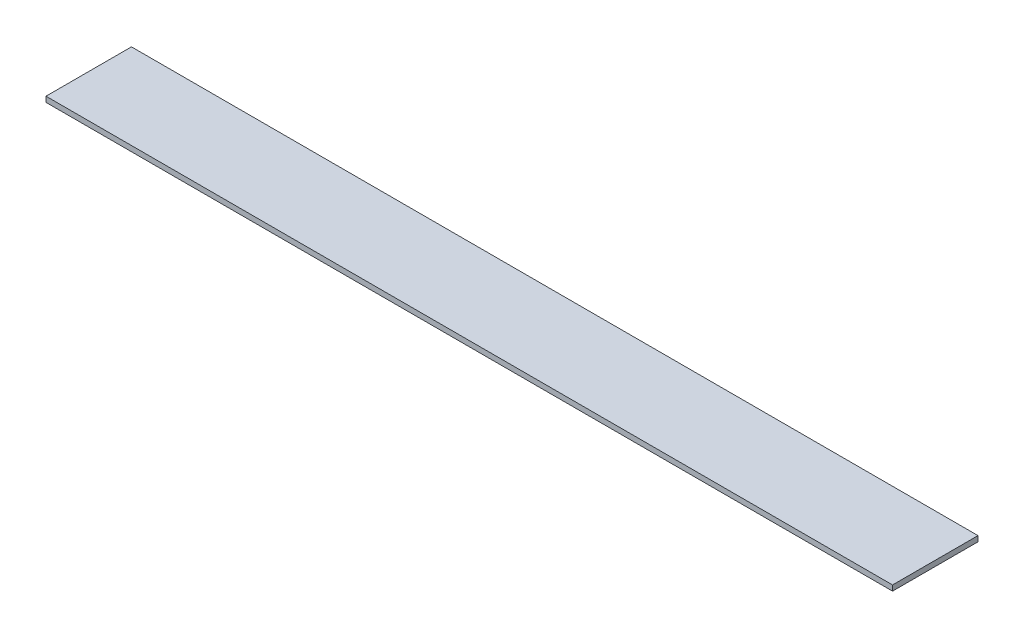
ISO-10303-21;
HEADER;
FILE_DESCRIPTION(('STEP AP214'),'2;1');
FILE_NAME('part.step','',(''),(''),'','','');
FILE_SCHEMA(('AUTOMOTIVE_DESIGN { 1 0 10303 214 1 1 1 1 }'));
ENDSEC;
DATA;
#1=APPLICATION_CONTEXT('core data for automotive mechanical design processes');
#2=APPLICATION_PROTOCOL_DEFINITION('international standard','automotive_design',2000,#1);
#3=PRODUCT_CONTEXT('',#1,'mechanical');
#4=PRODUCT('Part','Part','',(#3));
#5=PRODUCT_RELATED_PRODUCT_CATEGORY('part','',(#4));
#6=PRODUCT_DEFINITION_FORMATION('','',#4);
#7=PRODUCT_DEFINITION_CONTEXT('part definition',#1,'design');
#8=PRODUCT_DEFINITION('design','',#6,#7);
#9=PRODUCT_DEFINITION_SHAPE('','',#8);
#10=(LENGTH_UNIT() NAMED_UNIT(*) SI_UNIT(.MILLI.,.METRE.));
#11=(NAMED_UNIT(*) PLANE_ANGLE_UNIT() SI_UNIT($,.RADIAN.));
#12=(NAMED_UNIT(*) SI_UNIT($,.STERADIAN.) SOLID_ANGLE_UNIT());
#13=UNCERTAINTY_MEASURE_WITH_UNIT(LENGTH_MEASURE(1.E-05),#10,'distance_accuracy_value','');
#14=(GEOMETRIC_REPRESENTATION_CONTEXT(3) GLOBAL_UNCERTAINTY_ASSIGNED_CONTEXT((#13)) GLOBAL_UNIT_ASSIGNED_CONTEXT((#10,
#11,#12)) REPRESENTATION_CONTEXT('',''));
#15=CARTESIAN_POINT('',(0.,0.,0.));
#16=DIRECTION('',(0.,0.,1.));
#17=DIRECTION('',(1.,0.,0.));
#18=AXIS2_PLACEMENT_3D('',#15,#16,#17);
#19=CARTESIAN_POINT('',(940.,-12.,94.9));
#20=DIRECTION('',(1.,0.,0.));
#21=DIRECTION('',(0.,0.,-1.));
#22=AXIS2_PLACEMENT_3D('',#19,#20,#21);
#23=PLANE('',#22);
#24=DIRECTION('',(0.,0.,-1.));
#25=VECTOR('',#24,1.);
#26=CARTESIAN_POINT('',(940.,0.,94.9));
#27=LINE('',#26,#25);
#28=CARTESIAN_POINT('',(940.,0.,94.9));
#29=VERTEX_POINT('',#28);
#30=CARTESIAN_POINT('',(940.,0.,-94.9));
#31=VERTEX_POINT('',#30);
#32=EDGE_CURVE('E101',#29,#31,#27,.T.);
#33=ORIENTED_EDGE('',*,*,#32,.F.);
#34=DIRECTION('',(0.,1.,0.));
#35=VECTOR('',#34,1.);
#36=CARTESIAN_POINT('',(940.,-12.,94.9));
#37=LINE('',#36,#35);
#38=CARTESIAN_POINT('',(940.,-12.,94.9));
#39=VERTEX_POINT('',#38);
#40=EDGE_CURVE('E11',#39,#29,#37,.T.);
#41=ORIENTED_EDGE('',*,*,#40,.F.);
#42=DIRECTION('',(0.,0.,-1.));
#43=VECTOR('',#42,1.);
#44=CARTESIAN_POINT('',(940.,-12.,94.9));
#45=LINE('',#44,#43);
#46=CARTESIAN_POINT('',(940.,-12.,-94.9));
#47=VERTEX_POINT('',#46);
#48=EDGE_CURVE('E95',#39,#47,#45,.T.);
#49=ORIENTED_EDGE('',*,*,#48,.T.);
#50=DIRECTION('',(0.,1.,0.));
#51=VECTOR('',#50,1.);
#52=CARTESIAN_POINT('',(940.,-12.,-94.9));
#53=LINE('',#52,#51);
#54=EDGE_CURVE('E40',#47,#31,#53,.T.);
#55=ORIENTED_EDGE('',*,*,#54,.T.);
#56=EDGE_LOOP('',(#33,#41,#49,#55));
#57=FACE_BOUND('',#56,.T.);
#58=ADVANCED_FACE('F37',(#57),#23,.T.);
#59=CARTESIAN_POINT('',(-940.,-12.,94.9));
#60=DIRECTION('',(0.,0.,1.));
#61=DIRECTION('',(1.,0.,0.));
#62=AXIS2_PLACEMENT_3D('',#59,#60,#61);
#63=PLANE('',#62);
#64=DIRECTION('',(1.,0.,0.));
#65=VECTOR('',#64,1.);
#66=CARTESIAN_POINT('',(-940.,0.,94.9));
#67=LINE('',#66,#65);
#68=CARTESIAN_POINT('',(-940.,0.,94.9));
#69=VERTEX_POINT('',#68);
#70=EDGE_CURVE('E97',#69,#29,#67,.T.);
#71=ORIENTED_EDGE('',*,*,#70,.F.);
#72=DIRECTION('',(0.,1.,0.));
#73=VECTOR('',#72,1.);
#74=CARTESIAN_POINT('',(-940.,-12.,94.9));
#75=LINE('',#74,#73);
#76=CARTESIAN_POINT('',(-940.,-12.,94.9));
#77=VERTEX_POINT('',#76);
#78=EDGE_CURVE('E46',#77,#69,#75,.T.);
#79=ORIENTED_EDGE('',*,*,#78,.F.);
#80=DIRECTION('',(1.,0.,0.));
#81=VECTOR('',#80,1.);
#82=CARTESIAN_POINT('',(-940.,-12.,94.9));
#83=LINE('',#82,#81);
#84=EDGE_CURVE('E92',#77,#39,#83,.T.);
#85=ORIENTED_EDGE('',*,*,#84,.T.);
#86=ORIENTED_EDGE('',*,*,#40,.T.);
#87=EDGE_LOOP('',(#71,#79,#85,#86));
#88=FACE_BOUND('',#87,.T.);
#89=ADVANCED_FACE('F111',(#88),#63,.T.);
#90=CARTESIAN_POINT('',(-940.,-12.,94.9));
#91=DIRECTION('',(-1.,0.,0.));
#92=DIRECTION('',(0.,0.,1.));
#93=AXIS2_PLACEMENT_3D('',#90,#91,#92);
#94=PLANE('',#93);
#95=DIRECTION('',(0.,0.,1.));
#96=VECTOR('',#95,1.);
#97=CARTESIAN_POINT('',(-940.,0.,94.9));
#98=LINE('',#97,#96);
#99=CARTESIAN_POINT('',(-940.,0.,-94.9));
#100=VERTEX_POINT('',#99);
#101=EDGE_CURVE('E87',#100,#69,#98,.T.);
#102=ORIENTED_EDGE('',*,*,#101,.F.);
#103=DIRECTION('',(0.,1.,0.));
#104=VECTOR('',#103,1.);
#105=CARTESIAN_POINT('',(-940.,-12.,-94.9));
#106=LINE('',#105,#104);
#107=CARTESIAN_POINT('',(-940.,-12.,-94.9));
#108=VERTEX_POINT('',#107);
#109=EDGE_CURVE('E82',#108,#100,#106,.T.);
#110=ORIENTED_EDGE('',*,*,#109,.F.);
#111=DIRECTION('',(0.,0.,1.));
#112=VECTOR('',#111,1.);
#113=CARTESIAN_POINT('',(-940.,-12.,94.9));
#114=LINE('',#113,#112);
#115=EDGE_CURVE('E85',#108,#77,#114,.T.);
#116=ORIENTED_EDGE('',*,*,#115,.T.);
#117=ORIENTED_EDGE('',*,*,#78,.T.);
#118=EDGE_LOOP('',(#102,#110,#116,#117));
#119=FACE_BOUND('',#118,.T.);
#120=ADVANCED_FACE('F84',(#119),#94,.T.);
#121=CARTESIAN_POINT('',(-940.,-12.,-94.9));
#122=DIRECTION('',(0.,0.,-1.));
#123=DIRECTION('',(-1.,0.,0.));
#124=AXIS2_PLACEMENT_3D('',#121,#122,#123);
#125=PLANE('',#124);
#126=DIRECTION('',(-1.,0.,0.));
#127=VECTOR('',#126,1.);
#128=CARTESIAN_POINT('',(-940.,0.,-94.9));
#129=LINE('',#128,#127);
#130=EDGE_CURVE('E104',#31,#100,#129,.T.);
#131=ORIENTED_EDGE('',*,*,#130,.F.);
#132=ORIENTED_EDGE('',*,*,#54,.F.);
#133=DIRECTION('',(-1.,0.,0.));
#134=VECTOR('',#133,1.);
#135=CARTESIAN_POINT('',(-940.,-12.,-94.9));
#136=LINE('',#135,#134);
#137=EDGE_CURVE('E91',#47,#108,#136,.T.);
#138=ORIENTED_EDGE('',*,*,#137,.T.);
#139=ORIENTED_EDGE('',*,*,#109,.T.);
#140=EDGE_LOOP('',(#131,#132,#138,#139));
#141=FACE_BOUND('',#140,.T.);
#142=ADVANCED_FACE('F94',(#141),#125,.T.);
#143=CARTESIAN_POINT('',(0.,-12.,0.));
#144=DIRECTION('',(0.,-1.,0.));
#145=DIRECTION('',(0.,0.,-1.));
#146=AXIS2_PLACEMENT_3D('',#143,#144,#145);
#147=PLANE('',#146);
#148=ORIENTED_EDGE('',*,*,#48,.F.);
#149=ORIENTED_EDGE('',*,*,#84,.F.);
#150=ORIENTED_EDGE('',*,*,#115,.F.);
#151=ORIENTED_EDGE('',*,*,#137,.F.);
#152=EDGE_LOOP('',(#148,#149,#150,#151));
#153=FACE_BOUND('',#152,.T.);
#154=ADVANCED_FACE('F90',(#153),#147,.T.);
#155=CARTESIAN_POINT('',(0.,0.,0.));
#156=DIRECTION('',(0.,-1.,0.));
#157=DIRECTION('',(0.,0.,-1.));
#158=AXIS2_PLACEMENT_3D('',#155,#156,#157);
#159=PLANE('',#158);
#160=ORIENTED_EDGE('',*,*,#32,.T.);
#161=ORIENTED_EDGE('',*,*,#130,.T.);
#162=ORIENTED_EDGE('',*,*,#101,.T.);
#163=ORIENTED_EDGE('',*,*,#70,.T.);
#164=EDGE_LOOP('',(#160,#161,#162,#163));
#165=FACE_BOUND('',#164,.T.);
#166=ADVANCED_FACE('F110',(#165),#159,.F.);
#167=CLOSED_SHELL('',(#58,#89,#120,#142,#154,#166));
#168=MANIFOLD_SOLID_BREP('B2',#167);
#169=ADVANCED_BREP_SHAPE_REPRESENTATION('',(#18,#168),#14);
#170=SHAPE_DEFINITION_REPRESENTATION(#9,#169);
ENDSEC;
END-ISO-10303-21;
